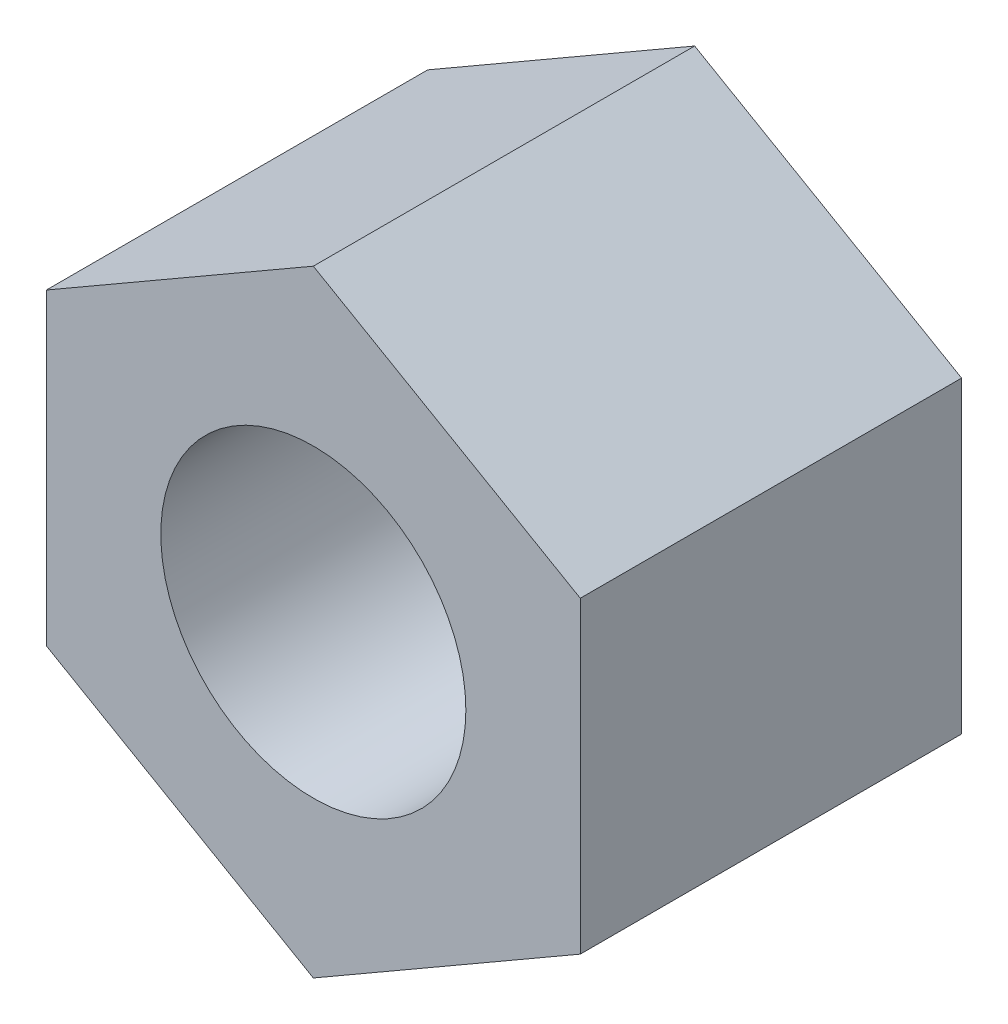
ISO-10303-21;
HEADER;
FILE_DESCRIPTION(('STEP AP214'),'2;1');
FILE_NAME('part.step','',(''),(''),'','','');
FILE_SCHEMA(('AUTOMOTIVE_DESIGN { 1 0 10303 214 1 1 1 1 }'));
ENDSEC;
DATA;
#1=APPLICATION_CONTEXT('core data for automotive mechanical design processes');
#2=APPLICATION_PROTOCOL_DEFINITION('international standard','automotive_design',2000,#1);
#3=PRODUCT_CONTEXT('',#1,'mechanical');
#4=PRODUCT('Part','Part','',(#3));
#5=PRODUCT_RELATED_PRODUCT_CATEGORY('part','',(#4));
#6=PRODUCT_DEFINITION_FORMATION('','',#4);
#7=PRODUCT_DEFINITION_CONTEXT('part definition',#1,'design');
#8=PRODUCT_DEFINITION('design','',#6,#7);
#9=PRODUCT_DEFINITION_SHAPE('','',#8);
#10=(LENGTH_UNIT() NAMED_UNIT(*) SI_UNIT(.MILLI.,.METRE.));
#11=(NAMED_UNIT(*) PLANE_ANGLE_UNIT() SI_UNIT($,.RADIAN.));
#12=(NAMED_UNIT(*) SI_UNIT($,.STERADIAN.) SOLID_ANGLE_UNIT());
#13=UNCERTAINTY_MEASURE_WITH_UNIT(LENGTH_MEASURE(1.E-05),#10,'distance_accuracy_value','');
#14=(GEOMETRIC_REPRESENTATION_CONTEXT(3) GLOBAL_UNCERTAINTY_ASSIGNED_CONTEXT((#13)) GLOBAL_UNIT_ASSIGNED_CONTEXT((#10,
#11,#12)) REPRESENTATION_CONTEXT('',''));
#15=CARTESIAN_POINT('',(0.,0.,0.));
#16=DIRECTION('',(0.,0.,1.));
#17=DIRECTION('',(1.,0.,0.));
#18=AXIS2_PLACEMENT_3D('',#15,#16,#17);
#19=CARTESIAN_POINT('',(3.5,-2.02072594216369,5.));
#20=DIRECTION('',(-1.,0.,0.));
#21=DIRECTION('',(0.,-1.,0.));
#22=AXIS2_PLACEMENT_3D('',#19,#20,#21);
#23=PLANE('',#22);
#24=DIRECTION('',(0.,1.,0.));
#25=VECTOR('',#24,1.);
#26=CARTESIAN_POINT('',(3.5,-2.02072594216369,0.));
#27=LINE('',#26,#25);
#28=CARTESIAN_POINT('',(3.5,-2.02072594216369,0.));
#29=VERTEX_POINT('',#28);
#30=CARTESIAN_POINT('',(3.5,2.02072594216369,0.));
#31=VERTEX_POINT('',#30);
#32=EDGE_CURVE('E133',#29,#31,#27,.T.);
#33=ORIENTED_EDGE('',*,*,#32,.T.);
#34=DIRECTION('',(0.,0.,-1.));
#35=VECTOR('',#34,1.);
#36=CARTESIAN_POINT('',(3.5,2.02072594216369,5.));
#37=LINE('',#36,#35);
#38=CARTESIAN_POINT('',(3.5,2.02072594216369,5.));
#39=VERTEX_POINT('',#38);
#40=EDGE_CURVE('E11',#39,#31,#37,.T.);
#41=ORIENTED_EDGE('',*,*,#40,.F.);
#42=DIRECTION('',(0.,1.,0.));
#43=VECTOR('',#42,1.);
#44=CARTESIAN_POINT('',(3.5,-2.02072594216369,5.));
#45=LINE('',#44,#43);
#46=CARTESIAN_POINT('',(3.5,-2.02072594216369,5.));
#47=VERTEX_POINT('',#46);
#48=EDGE_CURVE('E151',#47,#39,#45,.T.);
#49=ORIENTED_EDGE('',*,*,#48,.F.);
#50=DIRECTION('',(0.,0.,-1.));
#51=VECTOR('',#50,1.);
#52=CARTESIAN_POINT('',(3.5,-2.02072594216369,5.));
#53=LINE('',#52,#51);
#54=EDGE_CURVE('E128',#47,#29,#53,.T.);
#55=ORIENTED_EDGE('',*,*,#54,.T.);
#56=EDGE_LOOP('',(#33,#41,#49,#55));
#57=FACE_BOUND('',#56,.T.);
#58=ADVANCED_FACE('F44',(#57),#23,.F.);
#59=CARTESIAN_POINT('',(3.5,2.02072594216369,5.));
#60=DIRECTION('',(-0.5,-0.866025403784439,0.));
#61=DIRECTION('',(0.866025403784439,-0.5,0.));
#62=AXIS2_PLACEMENT_3D('',#59,#60,#61);
#63=PLANE('',#62);
#64=DIRECTION('',(-0.866025403784439,0.5,0.));
#65=VECTOR('',#64,1.);
#66=CARTESIAN_POINT('',(3.5,2.02072594216369,0.));
#67=LINE('',#66,#65);
#68=CARTESIAN_POINT('',(0.,4.04145188432738,0.));
#69=VERTEX_POINT('',#68);
#70=EDGE_CURVE('E140',#31,#69,#67,.T.);
#71=ORIENTED_EDGE('',*,*,#70,.T.);
#72=DIRECTION('',(0.,0.,-1.));
#73=VECTOR('',#72,1.);
#74=CARTESIAN_POINT('',(0.,4.04145188432738,5.));
#75=LINE('',#74,#73);
#76=CARTESIAN_POINT('',(0.,4.04145188432738,5.));
#77=VERTEX_POINT('',#76);
#78=EDGE_CURVE('E53',#77,#69,#75,.T.);
#79=ORIENTED_EDGE('',*,*,#78,.F.);
#80=DIRECTION('',(-0.866025403784439,0.5,0.));
#81=VECTOR('',#80,1.);
#82=CARTESIAN_POINT('',(3.5,2.02072594216369,5.));
#83=LINE('',#82,#81);
#84=EDGE_CURVE('E97',#39,#77,#83,.T.);
#85=ORIENTED_EDGE('',*,*,#84,.F.);
#86=ORIENTED_EDGE('',*,*,#40,.T.);
#87=EDGE_LOOP('',(#71,#79,#85,#86));
#88=FACE_BOUND('',#87,.T.);
#89=ADVANCED_FACE('F178',(#88),#63,.F.);
#90=CARTESIAN_POINT('',(0.,4.04145188432738,5.));
#91=DIRECTION('',(0.5,-0.866025403784439,0.));
#92=DIRECTION('',(0.866025403784439,0.5,0.));
#93=AXIS2_PLACEMENT_3D('',#90,#91,#92);
#94=PLANE('',#93);
#95=DIRECTION('',(-0.866025403784439,-0.5,0.));
#96=VECTOR('',#95,1.);
#97=CARTESIAN_POINT('',(0.,4.04145188432738,0.));
#98=LINE('',#97,#96);
#99=CARTESIAN_POINT('',(-3.5,2.02072594216369,0.));
#100=VERTEX_POINT('',#99);
#101=EDGE_CURVE('E142',#69,#100,#98,.T.);
#102=ORIENTED_EDGE('',*,*,#101,.T.);
#103=DIRECTION('',(0.,0.,-1.));
#104=VECTOR('',#103,1.);
#105=CARTESIAN_POINT('',(-3.5,2.02072594216369,5.));
#106=LINE('',#105,#104);
#107=CARTESIAN_POINT('',(-3.5,2.02072594216369,5.));
#108=VERTEX_POINT('',#107);
#109=EDGE_CURVE('E125',#108,#100,#106,.T.);
#110=ORIENTED_EDGE('',*,*,#109,.F.);
#111=DIRECTION('',(-0.866025403784439,-0.5,0.));
#112=VECTOR('',#111,1.);
#113=CARTESIAN_POINT('',(0.,4.04145188432738,5.));
#114=LINE('',#113,#112);
#115=EDGE_CURVE('E115',#77,#108,#114,.T.);
#116=ORIENTED_EDGE('',*,*,#115,.F.);
#117=ORIENTED_EDGE('',*,*,#78,.T.);
#118=EDGE_LOOP('',(#102,#110,#116,#117));
#119=FACE_BOUND('',#118,.T.);
#120=ADVANCED_FACE('F161',(#119),#94,.F.);
#121=CARTESIAN_POINT('',(-3.5,2.02072594216369,5.));
#122=DIRECTION('',(1.,0.,0.));
#123=DIRECTION('',(0.,1.,0.));
#124=AXIS2_PLACEMENT_3D('',#121,#122,#123);
#125=PLANE('',#124);
#126=DIRECTION('',(0.,-1.,0.));
#127=VECTOR('',#126,1.);
#128=CARTESIAN_POINT('',(-3.5,2.02072594216369,0.));
#129=LINE('',#128,#127);
#130=CARTESIAN_POINT('',(-3.5,-2.02072594216369,0.));
#131=VERTEX_POINT('',#130);
#132=EDGE_CURVE('E122',#100,#131,#129,.T.);
#133=ORIENTED_EDGE('',*,*,#132,.T.);
#134=DIRECTION('',(0.,0.,-1.));
#135=VECTOR('',#134,1.);
#136=CARTESIAN_POINT('',(-3.5,-2.02072594216369,5.));
#137=LINE('',#136,#135);
#138=CARTESIAN_POINT('',(-3.5,-2.02072594216369,5.));
#139=VERTEX_POINT('',#138);
#140=EDGE_CURVE('E120',#139,#131,#137,.T.);
#141=ORIENTED_EDGE('',*,*,#140,.F.);
#142=DIRECTION('',(0.,-1.,0.));
#143=VECTOR('',#142,1.);
#144=CARTESIAN_POINT('',(-3.5,2.02072594216369,5.));
#145=LINE('',#144,#143);
#146=EDGE_CURVE('E106',#108,#139,#145,.T.);
#147=ORIENTED_EDGE('',*,*,#146,.F.);
#148=ORIENTED_EDGE('',*,*,#109,.T.);
#149=EDGE_LOOP('',(#133,#141,#147,#148));
#150=FACE_BOUND('',#149,.T.);
#151=ADVANCED_FACE('F118',(#150),#125,.F.);
#152=CARTESIAN_POINT('',(-3.5,-2.02072594216369,5.));
#153=DIRECTION('',(0.5,0.866025403784439,0.));
#154=DIRECTION('',(-0.866025403784439,0.5,0.));
#155=AXIS2_PLACEMENT_3D('',#152,#153,#154);
#156=PLANE('',#155);
#157=DIRECTION('',(0.866025403784438,-0.5,0.));
#158=VECTOR('',#157,1.);
#159=CARTESIAN_POINT('',(-3.5,-2.02072594216369,0.));
#160=LINE('',#159,#158);
#161=CARTESIAN_POINT('',(0.,-4.04145188432738,0.));
#162=VERTEX_POINT('',#161);
#163=EDGE_CURVE('E83',#131,#162,#160,.T.);
#164=ORIENTED_EDGE('',*,*,#163,.T.);
#165=DIRECTION('',(0.,0.,-1.));
#166=VECTOR('',#165,1.);
#167=CARTESIAN_POINT('',(0.,-4.04145188432738,5.));
#168=LINE('',#167,#166);
#169=CARTESIAN_POINT('',(0.,-4.04145188432738,5.));
#170=VERTEX_POINT('',#169);
#171=EDGE_CURVE('E121',#170,#162,#168,.T.);
#172=ORIENTED_EDGE('',*,*,#171,.F.);
#173=DIRECTION('',(0.866025403784438,-0.5,0.));
#174=VECTOR('',#173,1.);
#175=CARTESIAN_POINT('',(-3.5,-2.02072594216369,5.));
#176=LINE('',#175,#174);
#177=EDGE_CURVE('E109',#139,#170,#176,.T.);
#178=ORIENTED_EDGE('',*,*,#177,.F.);
#179=ORIENTED_EDGE('',*,*,#140,.T.);
#180=EDGE_LOOP('',(#164,#172,#178,#179));
#181=FACE_BOUND('',#180,.T.);
#182=ADVANCED_FACE('F127',(#181),#156,.F.);
#183=CARTESIAN_POINT('',(0.,-4.04145188432738,5.));
#184=DIRECTION('',(-0.5,0.866025403784439,0.));
#185=DIRECTION('',(-0.866025403784439,-0.5,0.));
#186=AXIS2_PLACEMENT_3D('',#183,#184,#185);
#187=PLANE('',#186);
#188=DIRECTION('',(0.866025403784439,0.5,0.));
#189=VECTOR('',#188,1.);
#190=CARTESIAN_POINT('',(0.,-4.04145188432738,0.));
#191=LINE('',#190,#189);
#192=EDGE_CURVE('E93',#162,#29,#191,.T.);
#193=ORIENTED_EDGE('',*,*,#192,.T.);
#194=ORIENTED_EDGE('',*,*,#54,.F.);
#195=DIRECTION('',(0.866025403784439,0.5,0.));
#196=VECTOR('',#195,1.);
#197=CARTESIAN_POINT('',(0.,-4.04145188432738,5.));
#198=LINE('',#197,#196);
#199=EDGE_CURVE('E61',#170,#47,#198,.T.);
#200=ORIENTED_EDGE('',*,*,#199,.F.);
#201=ORIENTED_EDGE('',*,*,#171,.T.);
#202=EDGE_LOOP('',(#193,#194,#200,#201));
#203=FACE_BOUND('',#202,.T.);
#204=ADVANCED_FACE('F169',(#203),#187,.F.);
#205=CARTESIAN_POINT('',(0.,0.,5.));
#206=DIRECTION('',(0.,0.,1.));
#207=DIRECTION('',(1.,0.,0.));
#208=AXIS2_PLACEMENT_3D('',#205,#206,#207);
#209=PLANE('',#208);
#210=CARTESIAN_POINT('',(0.,0.,5.));
#211=DIRECTION('',(0.,0.,1.));
#212=DIRECTION('',(1.,0.,0.));
#213=AXIS2_PLACEMENT_3D('',#210,#211,#212);
#214=CIRCLE('',#213,2.);
#215=CARTESIAN_POINT('',(2.,0.,5.));
#216=VERTEX_POINT('',#215);
#217=EDGE_CURVE('E136',#216,#216,#214,.T.);
#218=ORIENTED_EDGE('',*,*,#217,.F.);
#219=EDGE_LOOP('',(#218));
#220=FACE_BOUND('',#219,.T.);
#221=ORIENTED_EDGE('',*,*,#48,.T.);
#222=ORIENTED_EDGE('',*,*,#84,.T.);
#223=ORIENTED_EDGE('',*,*,#115,.T.);
#224=ORIENTED_EDGE('',*,*,#146,.T.);
#225=ORIENTED_EDGE('',*,*,#177,.T.);
#226=ORIENTED_EDGE('',*,*,#199,.T.);
#227=EDGE_LOOP('',(#221,#222,#223,#224,#225,#226));
#228=FACE_BOUND('',#227,.T.);
#229=ADVANCED_FACE('F107',(#220,#228),#209,.T.);
#230=CARTESIAN_POINT('',(0.,0.,0.));
#231=DIRECTION('',(0.,0.,1.));
#232=DIRECTION('',(1.,0.,0.));
#233=AXIS2_PLACEMENT_3D('',#230,#231,#232);
#234=PLANE('',#233);
#235=CARTESIAN_POINT('',(0.,0.,0.));
#236=DIRECTION('',(0.,0.,1.));
#237=DIRECTION('',(1.,0.,0.));
#238=AXIS2_PLACEMENT_3D('',#235,#236,#237);
#239=CIRCLE('',#238,2.);
#240=CARTESIAN_POINT('',(2.,0.,0.));
#241=VERTEX_POINT('',#240);
#242=EDGE_CURVE('E237',#241,#241,#239,.T.);
#243=ORIENTED_EDGE('',*,*,#242,.T.);
#244=EDGE_LOOP('',(#243));
#245=FACE_BOUND('',#244,.T.);
#246=ORIENTED_EDGE('',*,*,#32,.F.);
#247=ORIENTED_EDGE('',*,*,#192,.F.);
#248=ORIENTED_EDGE('',*,*,#163,.F.);
#249=ORIENTED_EDGE('',*,*,#132,.F.);
#250=ORIENTED_EDGE('',*,*,#101,.F.);
#251=ORIENTED_EDGE('',*,*,#70,.F.);
#252=EDGE_LOOP('',(#246,#247,#248,#249,#250,#251));
#253=FACE_BOUND('',#252,.T.);
#254=ADVANCED_FACE('F163',(#245,#253),#234,.F.);
#255=CARTESIAN_POINT('',(0.,0.,5.));
#256=DIRECTION('',(0.,0.,-1.));
#257=DIRECTION('',(-1.,0.,0.));
#258=AXIS2_PLACEMENT_3D('',#255,#256,#257);
#259=CYLINDRICAL_SURFACE('',#258,2.);
#260=ORIENTED_EDGE('',*,*,#217,.T.);
#261=EDGE_LOOP('',(#260));
#262=FACE_BOUND('',#261,.T.);
#263=ORIENTED_EDGE('',*,*,#242,.F.);
#264=EDGE_LOOP('',(#263));
#265=FACE_BOUND('',#264,.T.);
#266=ADVANCED_FACE('F218',(#262,#265),#259,.F.);
#267=CLOSED_SHELL('',(#58,#89,#120,#151,#182,#204,#229,#254,#266));
#268=MANIFOLD_SOLID_BREP('B2',#267);
#269=ADVANCED_BREP_SHAPE_REPRESENTATION('',(#18,#268),#14);
#270=SHAPE_DEFINITION_REPRESENTATION(#9,#269);
ENDSEC;
END-ISO-10303-21;
